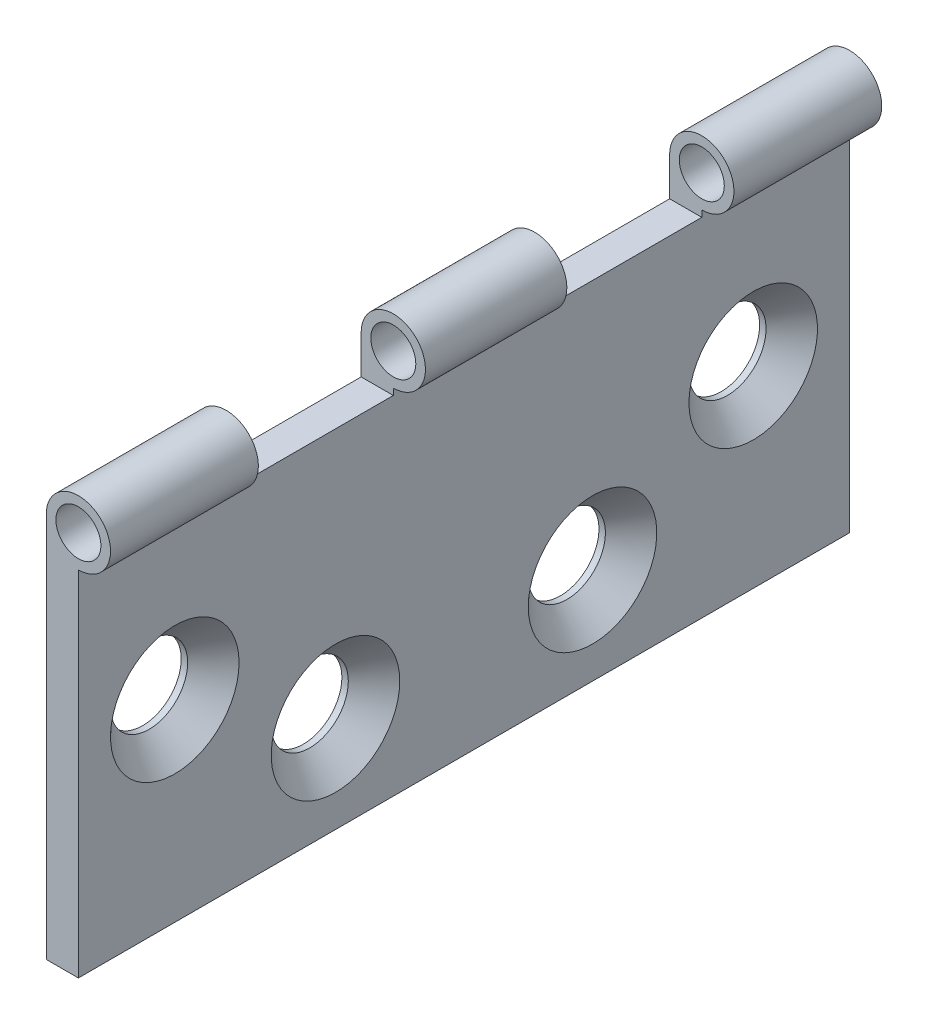
ISO-10303-21;
HEADER;
FILE_DESCRIPTION(('STEP AP214'),'2;1');
FILE_NAME('part.step','',(''),(''),'','','');
FILE_SCHEMA(('AUTOMOTIVE_DESIGN { 1 0 10303 214 1 1 1 1 }'));
ENDSEC;
DATA;
#1=APPLICATION_CONTEXT('core data for automotive mechanical design processes');
#2=APPLICATION_PROTOCOL_DEFINITION('international standard','automotive_design',2000,#1);
#3=PRODUCT_CONTEXT('',#1,'mechanical');
#4=PRODUCT('Part','Part','',(#3));
#5=PRODUCT_RELATED_PRODUCT_CATEGORY('part','',(#4));
#6=PRODUCT_DEFINITION_FORMATION('','',#4);
#7=PRODUCT_DEFINITION_CONTEXT('part definition',#1,'design');
#8=PRODUCT_DEFINITION('design','',#6,#7);
#9=PRODUCT_DEFINITION_SHAPE('','',#8);
#10=(LENGTH_UNIT() NAMED_UNIT(*) SI_UNIT(.MILLI.,.METRE.));
#11=(NAMED_UNIT(*) PLANE_ANGLE_UNIT() SI_UNIT($,.RADIAN.));
#12=(NAMED_UNIT(*) SI_UNIT($,.STERADIAN.) SOLID_ANGLE_UNIT());
#13=UNCERTAINTY_MEASURE_WITH_UNIT(LENGTH_MEASURE(1.E-05),#10,'distance_accuracy_value','');
#14=(GEOMETRIC_REPRESENTATION_CONTEXT(3) GLOBAL_UNCERTAINTY_ASSIGNED_CONTEXT((#13)) GLOBAL_UNIT_ASSIGNED_CONTEXT((#10,
#11,#12)) REPRESENTATION_CONTEXT('',''));
#15=CARTESIAN_POINT('',(0.,0.,0.));
#16=DIRECTION('',(0.,0.,1.));
#17=DIRECTION('',(1.,0.,0.));
#18=AXIS2_PLACEMENT_3D('',#15,#16,#17);
#19=CARTESIAN_POINT('',(5.,0.,60.));
#20=DIRECTION('',(-1.,0.,0.));
#21=DIRECTION('',(0.,0.,1.));
#22=AXIS2_PLACEMENT_3D('',#19,#20,#21);
#23=PLANE('',#22);
#24=CARTESIAN_POINT('',(5.,15.,-20.));
#25=DIRECTION('',(-1.,0.,0.));
#26=DIRECTION('',(0.,0.,1.));
#27=AXIS2_PLACEMENT_3D('',#24,#25,#26);
#28=CIRCLE('',#27,10.);
#29=CARTESIAN_POINT('',(5.,15.,-9.99999999999999));
#30=VERTEX_POINT('',#29);
#31=EDGE_CURVE('E197',#30,#30,#28,.T.);
#32=ORIENTED_EDGE('',*,*,#31,.T.);
#33=EDGE_LOOP('',(#32));
#34=FACE_BOUND('',#33,.T.);
#35=CARTESIAN_POINT('',(5.,30.,-45.));
#36=DIRECTION('',(-1.,0.,0.));
#37=DIRECTION('',(0.,0.,1.));
#38=AXIS2_PLACEMENT_3D('',#35,#36,#37);
#39=CIRCLE('',#38,10.);
#40=CARTESIAN_POINT('',(5.,30.,-35.));
#41=VERTEX_POINT('',#40);
#42=EDGE_CURVE('E206',#41,#41,#39,.T.);
#43=ORIENTED_EDGE('',*,*,#42,.T.);
#44=EDGE_LOOP('',(#43));
#45=FACE_BOUND('',#44,.T.);
#46=CARTESIAN_POINT('',(5.,30.,45.));
#47=DIRECTION('',(1.,0.,0.));
#48=DIRECTION('',(0.,0.,-1.));
#49=AXIS2_PLACEMENT_3D('',#46,#47,#48);
#50=CIRCLE('',#49,10.);
#51=CARTESIAN_POINT('',(5.,30.,35.));
#52=VERTEX_POINT('',#51);
#53=EDGE_CURVE('E215',#52,#52,#50,.T.);
#54=ORIENTED_EDGE('',*,*,#53,.F.);
#55=EDGE_LOOP('',(#54));
#56=FACE_BOUND('',#55,.T.);
#57=CARTESIAN_POINT('',(5.,15.,20.));
#58=DIRECTION('',(1.,0.,0.));
#59=DIRECTION('',(0.,0.,-1.));
#60=AXIS2_PLACEMENT_3D('',#57,#58,#59);
#61=CIRCLE('',#60,10.);
#62=CARTESIAN_POINT('',(5.,15.,9.99999999999999));
#63=VERTEX_POINT('',#62);
#64=EDGE_CURVE('E224',#63,#63,#61,.T.);
#65=ORIENTED_EDGE('',*,*,#64,.F.);
#66=EDGE_LOOP('',(#65));
#67=FACE_BOUND('',#66,.T.);
#68=DIRECTION('',(0.,1.,0.));
#69=VECTOR('',#68,1.);
#70=CARTESIAN_POINT('',(5.,0.,-37.));
#71=LINE('',#70,#69);
#72=CARTESIAN_POINT('',(5.,54.,-37.));
#73=VERTEX_POINT('',#72);
#74=CARTESIAN_POINT('',(5.,55.,-37.));
#75=VERTEX_POINT('',#74);
#76=EDGE_CURVE('E156',#73,#75,#71,.T.);
#77=ORIENTED_EDGE('',*,*,#76,.F.);
#78=DIRECTION('',(0.,0.,-1.));
#79=VECTOR('',#78,1.);
#80=CARTESIAN_POINT('',(5.,54.,60.));
#81=LINE('',#80,#79);
#82=CARTESIAN_POINT('',(5.,54.,-11.));
#83=VERTEX_POINT('',#82);
#84=EDGE_CURVE('E155',#83,#73,#81,.T.);
#85=ORIENTED_EDGE('',*,*,#84,.F.);
#86=DIRECTION('',(0.,-1.,0.));
#87=VECTOR('',#86,1.);
#88=CARTESIAN_POINT('',(5.,0.,-11.));
#89=LINE('',#88,#87);
#90=CARTESIAN_POINT('',(5.,55.,-11.));
#91=VERTEX_POINT('',#90);
#92=EDGE_CURVE('E186',#91,#83,#89,.T.);
#93=ORIENTED_EDGE('',*,*,#92,.F.);
#94=DIRECTION('',(0.,0.,-1.));
#95=VECTOR('',#94,1.);
#96=CARTESIAN_POINT('',(5.,55.,60.));
#97=LINE('',#96,#95);
#98=CARTESIAN_POINT('',(5.,55.,11.));
#99=VERTEX_POINT('',#98);
#100=EDGE_CURVE('E167',#99,#91,#97,.T.);
#101=ORIENTED_EDGE('',*,*,#100,.F.);
#102=DIRECTION('',(0.,1.,0.));
#103=VECTOR('',#102,1.);
#104=CARTESIAN_POINT('',(5.,0.,11.));
#105=LINE('',#104,#103);
#106=CARTESIAN_POINT('',(5.,54.,11.));
#107=VERTEX_POINT('',#106);
#108=EDGE_CURVE('E160',#107,#99,#105,.T.);
#109=ORIENTED_EDGE('',*,*,#108,.F.);
#110=DIRECTION('',(0.,0.,-1.));
#111=VECTOR('',#110,1.);
#112=CARTESIAN_POINT('',(5.,54.,60.));
#113=LINE('',#112,#111);
#114=CARTESIAN_POINT('',(5.,54.,37.));
#115=VERTEX_POINT('',#114);
#116=EDGE_CURVE('E145',#115,#107,#113,.T.);
#117=ORIENTED_EDGE('',*,*,#116,.F.);
#118=DIRECTION('',(0.,-1.,0.));
#119=VECTOR('',#118,1.);
#120=CARTESIAN_POINT('',(5.,0.,37.));
#121=LINE('',#120,#119);
#122=CARTESIAN_POINT('',(5.,55.,37.));
#123=VERTEX_POINT('',#122);
#124=EDGE_CURVE('E180',#123,#115,#121,.T.);
#125=ORIENTED_EDGE('',*,*,#124,.F.);
#126=CARTESIAN_POINT('',(5.,55.,60.));
#127=VERTEX_POINT('',#126);
#128=EDGE_CURVE('E248',#127,#123,#97,.T.);
#129=ORIENTED_EDGE('',*,*,#128,.F.);
#130=DIRECTION('',(0.,1.,0.));
#131=VECTOR('',#130,1.);
#132=CARTESIAN_POINT('',(5.,0.,60.));
#133=LINE('',#132,#131);
#134=CARTESIAN_POINT('',(5.,0.,60.));
#135=VERTEX_POINT('',#134);
#136=EDGE_CURVE('E252',#135,#127,#133,.T.);
#137=ORIENTED_EDGE('',*,*,#136,.F.);
#138=DIRECTION('',(0.,0.,-1.));
#139=VECTOR('',#138,1.);
#140=CARTESIAN_POINT('',(5.,0.,60.));
#141=LINE('',#140,#139);
#142=CARTESIAN_POINT('',(5.,0.,-60.));
#143=VERTEX_POINT('',#142);
#144=EDGE_CURVE('E261',#135,#143,#141,.T.);
#145=ORIENTED_EDGE('',*,*,#144,.T.);
#146=DIRECTION('',(0.,1.,0.));
#147=VECTOR('',#146,1.);
#148=CARTESIAN_POINT('',(5.,0.,-60.));
#149=LINE('',#148,#147);
#150=CARTESIAN_POINT('',(5.,55.,-60.));
#151=VERTEX_POINT('',#150);
#152=EDGE_CURVE('E251',#143,#151,#149,.T.);
#153=ORIENTED_EDGE('',*,*,#152,.T.);
#154=EDGE_CURVE('E247',#75,#151,#97,.T.);
#155=ORIENTED_EDGE('',*,*,#154,.F.);
#156=EDGE_LOOP('',(#77,#85,#93,#101,#109,#117,#125,#129,#137,#145,#153,#155));
#157=FACE_BOUND('',#156,.T.);
#158=ADVANCED_FACE('F48',(#34,#45,#56,#67,#157),#23,.F.);
#159=CARTESIAN_POINT('',(0.,0.,60.));
#160=DIRECTION('',(-1.,0.,0.));
#161=DIRECTION('',(0.,0.,1.));
#162=AXIS2_PLACEMENT_3D('',#159,#160,#161);
#163=PLANE('',#162);
#164=CARTESIAN_POINT('',(0.,15.,-20.));
#165=DIRECTION('',(-1.,0.,0.));
#166=DIRECTION('',(0.,0.,1.));
#167=AXIS2_PLACEMENT_3D('',#164,#165,#166);
#168=CIRCLE('',#167,6.);
#169=CARTESIAN_POINT('',(0.,15.,-14.));
#170=VERTEX_POINT('',#169);
#171=EDGE_CURVE('E200',#170,#170,#168,.T.);
#172=ORIENTED_EDGE('',*,*,#171,.F.);
#173=EDGE_LOOP('',(#172));
#174=FACE_BOUND('',#173,.T.);
#175=CARTESIAN_POINT('',(0.,30.,-45.));
#176=DIRECTION('',(-1.,0.,0.));
#177=DIRECTION('',(0.,0.,1.));
#178=AXIS2_PLACEMENT_3D('',#175,#176,#177);
#179=CIRCLE('',#178,6.);
#180=CARTESIAN_POINT('',(0.,30.,-39.));
#181=VERTEX_POINT('',#180);
#182=EDGE_CURVE('E209',#181,#181,#179,.T.);
#183=ORIENTED_EDGE('',*,*,#182,.F.);
#184=EDGE_LOOP('',(#183));
#185=FACE_BOUND('',#184,.T.);
#186=CARTESIAN_POINT('',(0.,30.,45.));
#187=DIRECTION('',(1.,0.,0.));
#188=DIRECTION('',(0.,0.,-1.));
#189=AXIS2_PLACEMENT_3D('',#186,#187,#188);
#190=CIRCLE('',#189,6.);
#191=CARTESIAN_POINT('',(0.,30.,39.));
#192=VERTEX_POINT('',#191);
#193=EDGE_CURVE('E221',#192,#192,#190,.T.);
#194=ORIENTED_EDGE('',*,*,#193,.T.);
#195=EDGE_LOOP('',(#194));
#196=FACE_BOUND('',#195,.T.);
#197=CARTESIAN_POINT('',(0.,15.,20.));
#198=DIRECTION('',(1.,0.,0.));
#199=DIRECTION('',(0.,0.,-1.));
#200=AXIS2_PLACEMENT_3D('',#197,#198,#199);
#201=CIRCLE('',#200,6.);
#202=CARTESIAN_POINT('',(0.,15.,14.));
#203=VERTEX_POINT('',#202);
#204=EDGE_CURVE('E230',#203,#203,#201,.T.);
#205=ORIENTED_EDGE('',*,*,#204,.T.);
#206=EDGE_LOOP('',(#205));
#207=FACE_BOUND('',#206,.T.);
#208=DIRECTION('',(0.,0.,-1.));
#209=VECTOR('',#208,1.);
#210=CARTESIAN_POINT('',(0.,54.,60.));
#211=LINE('',#210,#209);
#212=CARTESIAN_POINT('',(0.,54.,-11.));
#213=VERTEX_POINT('',#212);
#214=CARTESIAN_POINT('',(0.,54.,-37.));
#215=VERTEX_POINT('',#214);
#216=EDGE_CURVE('E13',#213,#215,#211,.T.);
#217=ORIENTED_EDGE('',*,*,#216,.T.);
#218=DIRECTION('',(0.,1.,0.));
#219=VECTOR('',#218,1.);
#220=CARTESIAN_POINT('',(0.,0.,-37.));
#221=LINE('',#220,#219);
#222=CARTESIAN_POINT('',(0.,60.,-37.));
#223=VERTEX_POINT('',#222);
#224=EDGE_CURVE('E191',#215,#223,#221,.T.);
#225=ORIENTED_EDGE('',*,*,#224,.T.);
#226=DIRECTION('',(0.,0.,-1.));
#227=VECTOR('',#226,1.);
#228=CARTESIAN_POINT('',(0.,60.,60.));
#229=LINE('',#228,#227);
#230=CARTESIAN_POINT('',(0.,60.,-60.));
#231=VERTEX_POINT('',#230);
#232=EDGE_CURVE('E272',#223,#231,#229,.T.);
#233=ORIENTED_EDGE('',*,*,#232,.T.);
#234=DIRECTION('',(0.,1.,0.));
#235=VECTOR('',#234,1.);
#236=CARTESIAN_POINT('',(0.,0.,-60.));
#237=LINE('',#236,#235);
#238=CARTESIAN_POINT('',(0.,0.,-60.));
#239=VERTEX_POINT('',#238);
#240=EDGE_CURVE('E264',#239,#231,#237,.T.);
#241=ORIENTED_EDGE('',*,*,#240,.F.);
#242=DIRECTION('',(0.,0.,-1.));
#243=VECTOR('',#242,1.);
#244=CARTESIAN_POINT('',(0.,0.,60.));
#245=LINE('',#244,#243);
#246=CARTESIAN_POINT('',(0.,0.,60.));
#247=VERTEX_POINT('',#246);
#248=EDGE_CURVE('E270',#247,#239,#245,.T.);
#249=ORIENTED_EDGE('',*,*,#248,.F.);
#250=DIRECTION('',(0.,1.,0.));
#251=VECTOR('',#250,1.);
#252=CARTESIAN_POINT('',(0.,0.,60.));
#253=LINE('',#252,#251);
#254=CARTESIAN_POINT('',(0.,60.,60.));
#255=VERTEX_POINT('',#254);
#256=EDGE_CURVE('E255',#247,#255,#253,.T.);
#257=ORIENTED_EDGE('',*,*,#256,.T.);
#258=CARTESIAN_POINT('',(0.,60.,37.));
#259=VERTEX_POINT('',#258);
#260=EDGE_CURVE('E273',#255,#259,#229,.T.);
#261=ORIENTED_EDGE('',*,*,#260,.T.);
#262=DIRECTION('',(0.,-1.,0.));
#263=VECTOR('',#262,1.);
#264=CARTESIAN_POINT('',(0.,0.,37.));
#265=LINE('',#264,#263);
#266=CARTESIAN_POINT('',(0.,54.,37.));
#267=VERTEX_POINT('',#266);
#268=EDGE_CURVE('E177',#259,#267,#265,.T.);
#269=ORIENTED_EDGE('',*,*,#268,.T.);
#270=DIRECTION('',(0.,0.,-1.));
#271=VECTOR('',#270,1.);
#272=CARTESIAN_POINT('',(0.,54.,60.));
#273=LINE('',#272,#271);
#274=CARTESIAN_POINT('',(0.,54.,11.));
#275=VERTEX_POINT('',#274);
#276=EDGE_CURVE('E55',#267,#275,#273,.T.);
#277=ORIENTED_EDGE('',*,*,#276,.T.);
#278=DIRECTION('',(0.,1.,0.));
#279=VECTOR('',#278,1.);
#280=CARTESIAN_POINT('',(0.,0.,11.));
#281=LINE('',#280,#279);
#282=CARTESIAN_POINT('',(0.,60.,11.));
#283=VERTEX_POINT('',#282);
#284=EDGE_CURVE('E163',#275,#283,#281,.T.);
#285=ORIENTED_EDGE('',*,*,#284,.T.);
#286=CARTESIAN_POINT('',(0.,60.,-11.));
#287=VERTEX_POINT('',#286);
#288=EDGE_CURVE('E276',#283,#287,#229,.T.);
#289=ORIENTED_EDGE('',*,*,#288,.T.);
#290=DIRECTION('',(0.,-1.,0.));
#291=VECTOR('',#290,1.);
#292=CARTESIAN_POINT('',(0.,0.,-11.));
#293=LINE('',#292,#291);
#294=EDGE_CURVE('E70',#287,#213,#293,.T.);
#295=ORIENTED_EDGE('',*,*,#294,.T.);
#296=EDGE_LOOP('',(#217,#225,#233,#241,#249,#257,#261,#269,#277,#285,#289,#295));
#297=FACE_BOUND('',#296,.T.);
#298=ADVANCED_FACE('F285',(#174,#185,#196,#207,#297),#163,.T.);
#299=CARTESIAN_POINT('',(5.,60.,60.));
#300=DIRECTION('',(0.,0.,-1.));
#301=DIRECTION('',(-1.,0.,0.));
#302=AXIS2_PLACEMENT_3D('',#299,#300,#301);
#303=CYLINDRICAL_SURFACE('',#302,5.);
#304=CARTESIAN_POINT('',(5.,60.,-37.));
#305=DIRECTION('',(0.,0.,1.));
#306=DIRECTION('',(1.,0.,0.));
#307=AXIS2_PLACEMENT_3D('',#304,#305,#306);
#308=CIRCLE('',#307,5.);
#309=EDGE_CURVE('E189',#75,#223,#308,.T.);
#310=ORIENTED_EDGE('',*,*,#309,.F.);
#311=ORIENTED_EDGE('',*,*,#154,.T.);
#312=CARTESIAN_POINT('',(5.,60.,-60.));
#313=DIRECTION('',(0.,0.,1.));
#314=DIRECTION('',(1.,0.,0.));
#315=AXIS2_PLACEMENT_3D('',#312,#313,#314);
#316=CIRCLE('',#315,5.);
#317=CARTESIAN_POINT('',(10.,60.,-60.));
#318=VERTEX_POINT('',#317);
#319=EDGE_CURVE('E243',#151,#318,#316,.T.);
#320=ORIENTED_EDGE('',*,*,#319,.T.);
#321=EDGE_CURVE('E244',#318,#231,#316,.T.);
#322=ORIENTED_EDGE('',*,*,#321,.T.);
#323=ORIENTED_EDGE('',*,*,#232,.F.);
#324=EDGE_LOOP('',(#310,#311,#320,#322,#323));
#325=FACE_BOUND('',#324,.T.);
#326=ADVANCED_FACE('F308',(#325),#303,.T.);
#327=ORIENTED_EDGE('',*,*,#100,.T.);
#328=CARTESIAN_POINT('',(5.,60.,-11.));
#329=DIRECTION('',(0.,0.,-1.));
#330=DIRECTION('',(-1.,0.,0.));
#331=AXIS2_PLACEMENT_3D('',#328,#329,#330);
#332=CIRCLE('',#331,5.);
#333=EDGE_CURVE('E183',#287,#91,#332,.T.);
#334=ORIENTED_EDGE('',*,*,#333,.F.);
#335=ORIENTED_EDGE('',*,*,#288,.F.);
#336=CARTESIAN_POINT('',(5.,60.,11.));
#337=DIRECTION('',(0.,0.,1.));
#338=DIRECTION('',(1.,0.,0.));
#339=AXIS2_PLACEMENT_3D('',#336,#337,#338);
#340=CIRCLE('',#339,5.);
#341=EDGE_CURVE('E62',#99,#283,#340,.T.);
#342=ORIENTED_EDGE('',*,*,#341,.F.);
#343=EDGE_LOOP('',(#327,#334,#335,#342));
#344=FACE_BOUND('',#343,.T.);
#345=ADVANCED_FACE('F324',(#344),#303,.T.);
#346=ORIENTED_EDGE('',*,*,#128,.T.);
#347=CARTESIAN_POINT('',(5.,60.,37.));
#348=DIRECTION('',(0.,0.,-1.));
#349=DIRECTION('',(-1.,0.,0.));
#350=AXIS2_PLACEMENT_3D('',#347,#348,#349);
#351=CIRCLE('',#350,5.);
#352=EDGE_CURVE('E171',#259,#123,#351,.T.);
#353=ORIENTED_EDGE('',*,*,#352,.F.);
#354=ORIENTED_EDGE('',*,*,#260,.F.);
#355=CARTESIAN_POINT('',(5.,60.,60.));
#356=DIRECTION('',(0.,0.,1.));
#357=DIRECTION('',(1.,0.,0.));
#358=AXIS2_PLACEMENT_3D('',#355,#356,#357);
#359=CIRCLE('',#358,5.);
#360=CARTESIAN_POINT('',(10.,60.,60.));
#361=VERTEX_POINT('',#360);
#362=EDGE_CURVE('E240',#361,#255,#359,.T.);
#363=ORIENTED_EDGE('',*,*,#362,.F.);
#364=EDGE_CURVE('E237',#127,#361,#359,.T.);
#365=ORIENTED_EDGE('',*,*,#364,.F.);
#366=EDGE_LOOP('',(#346,#353,#354,#363,#365));
#367=FACE_BOUND('',#366,.T.);
#368=ADVANCED_FACE('F321',(#367),#303,.T.);
#369=CARTESIAN_POINT('',(5.,60.,-60.));
#370=DIRECTION('',(0.,0.,1.));
#371=DIRECTION('',(1.,0.,0.));
#372=AXIS2_PLACEMENT_3D('',#369,#370,#371);
#373=CYLINDRICAL_SURFACE('',#372,3.5);
#374=CARTESIAN_POINT('',(5.,60.,-60.));
#375=DIRECTION('',(0.,0.,1.));
#376=DIRECTION('',(1.,0.,0.));
#377=AXIS2_PLACEMENT_3D('',#374,#375,#376);
#378=CIRCLE('',#377,3.5);
#379=CARTESIAN_POINT('',(8.5,60.,-60.));
#380=VERTEX_POINT('',#379);
#381=EDGE_CURVE('E234',#380,#380,#378,.T.);
#382=ORIENTED_EDGE('',*,*,#381,.F.);
#383=EDGE_LOOP('',(#382));
#384=FACE_BOUND('',#383,.T.);
#385=CARTESIAN_POINT('',(5.,60.,-37.));
#386=DIRECTION('',(0.,0.,1.));
#387=DIRECTION('',(1.,0.,0.));
#388=AXIS2_PLACEMENT_3D('',#385,#386,#387);
#389=CIRCLE('',#388,3.5);
#390=CARTESIAN_POINT('',(8.5,60.,-37.));
#391=VERTEX_POINT('',#390);
#392=EDGE_CURVE('E188',#391,#391,#389,.F.);
#393=ORIENTED_EDGE('',*,*,#392,.F.);
#394=EDGE_LOOP('',(#393));
#395=FACE_BOUND('',#394,.T.);
#396=ADVANCED_FACE('F323',(#384,#395),#373,.F.);
#397=CARTESIAN_POINT('',(5.,60.,60.));
#398=DIRECTION('',(0.,0.,1.));
#399=DIRECTION('',(1.,0.,0.));
#400=AXIS2_PLACEMENT_3D('',#397,#398,#399);
#401=CIRCLE('',#400,3.5);
#402=CARTESIAN_POINT('',(8.5,60.,60.));
#403=VERTEX_POINT('',#402);
#404=EDGE_CURVE('E233',#403,#403,#401,.T.);
#405=ORIENTED_EDGE('',*,*,#404,.T.);
#406=EDGE_LOOP('',(#405));
#407=FACE_BOUND('',#406,.T.);
#408=CARTESIAN_POINT('',(5.,60.,37.));
#409=DIRECTION('',(0.,0.,-1.));
#410=DIRECTION('',(-1.,0.,0.));
#411=AXIS2_PLACEMENT_3D('',#408,#409,#410);
#412=CIRCLE('',#411,3.5);
#413=CARTESIAN_POINT('',(1.5,60.,37.));
#414=VERTEX_POINT('',#413);
#415=EDGE_CURVE('E168',#414,#414,#412,.F.);
#416=ORIENTED_EDGE('',*,*,#415,.F.);
#417=EDGE_LOOP('',(#416));
#418=FACE_BOUND('',#417,.T.);
#419=ADVANCED_FACE('F330',(#407,#418),#373,.F.);
#420=CARTESIAN_POINT('',(5.,0.,60.));
#421=DIRECTION('',(0.,-1.,0.));
#422=DIRECTION('',(0.,0.,-1.));
#423=AXIS2_PLACEMENT_3D('',#420,#421,#422);
#424=PLANE('',#423);
#425=DIRECTION('',(-1.,0.,0.));
#426=VECTOR('',#425,1.);
#427=CARTESIAN_POINT('',(5.,0.,-60.));
#428=LINE('',#427,#426);
#429=EDGE_CURVE('E256',#143,#239,#428,.T.);
#430=ORIENTED_EDGE('',*,*,#429,.F.);
#431=ORIENTED_EDGE('',*,*,#144,.F.);
#432=DIRECTION('',(-1.,0.,0.));
#433=VECTOR('',#432,1.);
#434=CARTESIAN_POINT('',(5.,0.,60.));
#435=LINE('',#434,#433);
#436=EDGE_CURVE('E258',#135,#247,#435,.T.);
#437=ORIENTED_EDGE('',*,*,#436,.T.);
#438=ORIENTED_EDGE('',*,*,#248,.T.);
#439=EDGE_LOOP('',(#430,#431,#437,#438));
#440=FACE_BOUND('',#439,.T.);
#441=ADVANCED_FACE('F311',(#440),#424,.T.);
#442=CARTESIAN_POINT('',(0.,0.,60.));
#443=DIRECTION('',(0.,0.,-1.));
#444=DIRECTION('',(-1.,0.,0.));
#445=AXIS2_PLACEMENT_3D('',#442,#443,#444);
#446=PLANE('',#445);
#447=ORIENTED_EDGE('',*,*,#404,.F.);
#448=EDGE_LOOP('',(#447));
#449=FACE_BOUND('',#448,.T.);
#450=ORIENTED_EDGE('',*,*,#136,.T.);
#451=ORIENTED_EDGE('',*,*,#364,.T.);
#452=ORIENTED_EDGE('',*,*,#362,.T.);
#453=ORIENTED_EDGE('',*,*,#256,.F.);
#454=ORIENTED_EDGE('',*,*,#436,.F.);
#455=EDGE_LOOP('',(#450,#451,#452,#453,#454));
#456=FACE_BOUND('',#455,.T.);
#457=ADVANCED_FACE('F317',(#449,#456),#446,.F.);
#458=CARTESIAN_POINT('',(0.,0.,-60.));
#459=DIRECTION('',(0.,0.,-1.));
#460=DIRECTION('',(-1.,0.,0.));
#461=AXIS2_PLACEMENT_3D('',#458,#459,#460);
#462=PLANE('',#461);
#463=ORIENTED_EDGE('',*,*,#381,.T.);
#464=EDGE_LOOP('',(#463));
#465=FACE_BOUND('',#464,.T.);
#466=ORIENTED_EDGE('',*,*,#240,.T.);
#467=ORIENTED_EDGE('',*,*,#321,.F.);
#468=ORIENTED_EDGE('',*,*,#319,.F.);
#469=ORIENTED_EDGE('',*,*,#152,.F.);
#470=ORIENTED_EDGE('',*,*,#429,.T.);
#471=EDGE_LOOP('',(#466,#467,#468,#469,#470));
#472=FACE_BOUND('',#471,.T.);
#473=ADVANCED_FACE('F304',(#465,#472),#462,.T.);
#474=CARTESIAN_POINT('',(5.,15.,20.));
#475=DIRECTION('',(1.,0.,0.));
#476=DIRECTION('',(0.,0.,-1.));
#477=AXIS2_PLACEMENT_3D('',#474,#475,#476);
#478=CYLINDRICAL_SURFACE('',#477,6.);
#479=ORIENTED_EDGE('',*,*,#204,.F.);
#480=EDGE_LOOP('',(#479));
#481=FACE_BOUND('',#480,.T.);
#482=CARTESIAN_POINT('',(1.,15.,20.));
#483=DIRECTION('',(1.,0.,0.));
#484=DIRECTION('',(0.,0.,-1.));
#485=AXIS2_PLACEMENT_3D('',#482,#483,#484);
#486=CIRCLE('',#485,6.);
#487=CARTESIAN_POINT('',(1.,15.,14.));
#488=VERTEX_POINT('',#487);
#489=EDGE_CURVE('E227',#488,#488,#486,.T.);
#490=ORIENTED_EDGE('',*,*,#489,.T.);
#491=EDGE_LOOP('',(#490));
#492=FACE_BOUND('',#491,.T.);
#493=ADVANCED_FACE('F353',(#481,#492),#478,.F.);
#494=CARTESIAN_POINT('',(5.,15.,20.));
#495=DIRECTION('',(1.,0.,0.));
#496=DIRECTION('',(0.,0.,-1.));
#497=AXIS2_PLACEMENT_3D('',#494,#495,#496);
#498=CONICAL_SURFACE('',#497,10.,0.785398163397449);
#499=ORIENTED_EDGE('',*,*,#489,.F.);
#500=EDGE_LOOP('',(#499));
#501=FACE_BOUND('',#500,.T.);
#502=ORIENTED_EDGE('',*,*,#64,.T.);
#503=EDGE_LOOP('',(#502));
#504=FACE_BOUND('',#503,.T.);
#505=ADVANCED_FACE('F350',(#501,#504),#498,.F.);
#506=CARTESIAN_POINT('',(5.,30.,45.));
#507=DIRECTION('',(1.,0.,0.));
#508=DIRECTION('',(0.,0.,-1.));
#509=AXIS2_PLACEMENT_3D('',#506,#507,#508);
#510=CYLINDRICAL_SURFACE('',#509,6.);
#511=ORIENTED_EDGE('',*,*,#193,.F.);
#512=EDGE_LOOP('',(#511));
#513=FACE_BOUND('',#512,.T.);
#514=CARTESIAN_POINT('',(1.,30.,45.));
#515=DIRECTION('',(1.,0.,0.));
#516=DIRECTION('',(0.,0.,-1.));
#517=AXIS2_PLACEMENT_3D('',#514,#515,#516);
#518=CIRCLE('',#517,6.);
#519=CARTESIAN_POINT('',(1.,30.,39.));
#520=VERTEX_POINT('',#519);
#521=EDGE_CURVE('E218',#520,#520,#518,.T.);
#522=ORIENTED_EDGE('',*,*,#521,.T.);
#523=EDGE_LOOP('',(#522));
#524=FACE_BOUND('',#523,.T.);
#525=ADVANCED_FACE('F352',(#513,#524),#510,.F.);
#526=CARTESIAN_POINT('',(5.,30.,45.));
#527=DIRECTION('',(1.,0.,0.));
#528=DIRECTION('',(0.,0.,-1.));
#529=AXIS2_PLACEMENT_3D('',#526,#527,#528);
#530=CONICAL_SURFACE('',#529,10.,0.785398163397449);
#531=ORIENTED_EDGE('',*,*,#521,.F.);
#532=EDGE_LOOP('',(#531));
#533=FACE_BOUND('',#532,.T.);
#534=ORIENTED_EDGE('',*,*,#53,.T.);
#535=EDGE_LOOP('',(#534));
#536=FACE_BOUND('',#535,.T.);
#537=ADVANCED_FACE('F360',(#533,#536),#530,.F.);
#538=CARTESIAN_POINT('',(5.,30.,-45.));
#539=DIRECTION('',(1.,0.,0.));
#540=DIRECTION('',(0.,0.,1.));
#541=AXIS2_PLACEMENT_3D('',#538,#539,#540);
#542=CYLINDRICAL_SURFACE('',#541,6.);
#543=ORIENTED_EDGE('',*,*,#182,.T.);
#544=EDGE_LOOP('',(#543));
#545=FACE_BOUND('',#544,.T.);
#546=CARTESIAN_POINT('',(1.,30.,-45.));
#547=DIRECTION('',(-1.,0.,0.));
#548=DIRECTION('',(0.,0.,1.));
#549=AXIS2_PLACEMENT_3D('',#546,#547,#548);
#550=CIRCLE('',#549,6.);
#551=CARTESIAN_POINT('',(1.,30.,-39.));
#552=VERTEX_POINT('',#551);
#553=EDGE_CURVE('E212',#552,#552,#550,.T.);
#554=ORIENTED_EDGE('',*,*,#553,.F.);
#555=EDGE_LOOP('',(#554));
#556=FACE_BOUND('',#555,.T.);
#557=ADVANCED_FACE('F369',(#545,#556),#542,.F.);
#558=CARTESIAN_POINT('',(5.,30.,-45.));
#559=DIRECTION('',(1.,0.,0.));
#560=DIRECTION('',(0.,0.,1.));
#561=AXIS2_PLACEMENT_3D('',#558,#559,#560);
#562=CONICAL_SURFACE('',#561,10.,0.785398163397449);
#563=ORIENTED_EDGE('',*,*,#553,.T.);
#564=EDGE_LOOP('',(#563));
#565=FACE_BOUND('',#564,.T.);
#566=ORIENTED_EDGE('',*,*,#42,.F.);
#567=EDGE_LOOP('',(#566));
#568=FACE_BOUND('',#567,.T.);
#569=ADVANCED_FACE('F373',(#565,#568),#562,.F.);
#570=CARTESIAN_POINT('',(5.,15.,-20.));
#571=DIRECTION('',(1.,0.,0.));
#572=DIRECTION('',(0.,0.,1.));
#573=AXIS2_PLACEMENT_3D('',#570,#571,#572);
#574=CYLINDRICAL_SURFACE('',#573,6.);
#575=ORIENTED_EDGE('',*,*,#171,.T.);
#576=EDGE_LOOP('',(#575));
#577=FACE_BOUND('',#576,.T.);
#578=CARTESIAN_POINT('',(1.,15.,-20.));
#579=DIRECTION('',(-1.,0.,0.));
#580=DIRECTION('',(0.,0.,1.));
#581=AXIS2_PLACEMENT_3D('',#578,#579,#580);
#582=CIRCLE('',#581,6.);
#583=CARTESIAN_POINT('',(1.,15.,-14.));
#584=VERTEX_POINT('',#583);
#585=EDGE_CURVE('E203',#584,#584,#582,.T.);
#586=ORIENTED_EDGE('',*,*,#585,.F.);
#587=EDGE_LOOP('',(#586));
#588=FACE_BOUND('',#587,.T.);
#589=ADVANCED_FACE('F377',(#577,#588),#574,.F.);
#590=CARTESIAN_POINT('',(5.,15.,-20.));
#591=DIRECTION('',(1.,0.,0.));
#592=DIRECTION('',(0.,0.,1.));
#593=AXIS2_PLACEMENT_3D('',#590,#591,#592);
#594=CONICAL_SURFACE('',#593,10.,0.785398163397449);
#595=ORIENTED_EDGE('',*,*,#585,.T.);
#596=EDGE_LOOP('',(#595));
#597=FACE_BOUND('',#596,.T.);
#598=ORIENTED_EDGE('',*,*,#31,.F.);
#599=EDGE_LOOP('',(#598));
#600=FACE_BOUND('',#599,.T.);
#601=ADVANCED_FACE('F381',(#597,#600),#594,.F.);
#602=CARTESIAN_POINT('',(15.,54.,37.));
#603=DIRECTION('',(0.,1.,0.));
#604=DIRECTION('',(0.,0.,1.));
#605=AXIS2_PLACEMENT_3D('',#602,#603,#604);
#606=PLANE('',#605);
#607=ORIENTED_EDGE('',*,*,#116,.T.);
#608=DIRECTION('',(-1.,0.,0.));
#609=VECTOR('',#608,1.);
#610=CARTESIAN_POINT('',(15.,54.,11.));
#611=LINE('',#610,#609);
#612=EDGE_CURVE('E148',#107,#275,#611,.T.);
#613=ORIENTED_EDGE('',*,*,#612,.T.);
#614=ORIENTED_EDGE('',*,*,#276,.F.);
#615=DIRECTION('',(-1.,0.,0.));
#616=VECTOR('',#615,1.);
#617=CARTESIAN_POINT('',(15.,54.,37.));
#618=LINE('',#617,#616);
#619=EDGE_CURVE('E151',#115,#267,#618,.T.);
#620=ORIENTED_EDGE('',*,*,#619,.F.);
#621=EDGE_LOOP('',(#607,#613,#614,#620));
#622=FACE_BOUND('',#621,.T.);
#623=ADVANCED_FACE('F147',(#622),#606,.T.);
#624=CARTESIAN_POINT('',(15.,54.,37.));
#625=DIRECTION('',(0.,0.,-1.));
#626=DIRECTION('',(-1.,0.,0.));
#627=AXIS2_PLACEMENT_3D('',#624,#625,#626);
#628=PLANE('',#627);
#629=ORIENTED_EDGE('',*,*,#415,.T.);
#630=EDGE_LOOP('',(#629));
#631=FACE_BOUND('',#630,.T.);
#632=ORIENTED_EDGE('',*,*,#124,.T.);
#633=ORIENTED_EDGE('',*,*,#619,.T.);
#634=ORIENTED_EDGE('',*,*,#268,.F.);
#635=ORIENTED_EDGE('',*,*,#352,.T.);
#636=EDGE_LOOP('',(#632,#633,#634,#635));
#637=FACE_BOUND('',#636,.T.);
#638=ADVANCED_FACE('F288',(#631,#637),#628,.T.);
#639=CARTESIAN_POINT('',(15.,54.,11.));
#640=DIRECTION('',(0.,0.,1.));
#641=DIRECTION('',(1.,0.,0.));
#642=AXIS2_PLACEMENT_3D('',#639,#640,#641);
#643=PLANE('',#642);
#644=CARTESIAN_POINT('',(5.,60.,11.));
#645=DIRECTION('',(0.,0.,1.));
#646=DIRECTION('',(1.,0.,0.));
#647=AXIS2_PLACEMENT_3D('',#644,#645,#646);
#648=CIRCLE('',#647,3.5);
#649=CARTESIAN_POINT('',(8.5,60.,11.));
#650=VERTEX_POINT('',#649);
#651=EDGE_CURVE('E277',#650,#650,#648,.F.);
#652=ORIENTED_EDGE('',*,*,#651,.T.);
#653=EDGE_LOOP('',(#652));
#654=FACE_BOUND('',#653,.T.);
#655=ORIENTED_EDGE('',*,*,#108,.T.);
#656=ORIENTED_EDGE('',*,*,#341,.T.);
#657=ORIENTED_EDGE('',*,*,#284,.F.);
#658=ORIENTED_EDGE('',*,*,#612,.F.);
#659=EDGE_LOOP('',(#655,#656,#657,#658));
#660=FACE_BOUND('',#659,.T.);
#661=ADVANCED_FACE('F159',(#654,#660),#643,.T.);
#662=CARTESIAN_POINT('',(15.,54.,-11.));
#663=DIRECTION('',(0.,1.,0.));
#664=DIRECTION('',(0.,0.,1.));
#665=AXIS2_PLACEMENT_3D('',#662,#663,#664);
#666=PLANE('',#665);
#667=ORIENTED_EDGE('',*,*,#84,.T.);
#668=DIRECTION('',(-1.,0.,0.));
#669=VECTOR('',#668,1.);
#670=CARTESIAN_POINT('',(15.,54.,-37.));
#671=LINE('',#670,#669);
#672=EDGE_CURVE('E290',#73,#215,#671,.T.);
#673=ORIENTED_EDGE('',*,*,#672,.T.);
#674=ORIENTED_EDGE('',*,*,#216,.F.);
#675=DIRECTION('',(-1.,0.,0.));
#676=VECTOR('',#675,1.);
#677=CARTESIAN_POINT('',(15.,54.,-11.));
#678=LINE('',#677,#676);
#679=EDGE_CURVE('E279',#83,#213,#678,.T.);
#680=ORIENTED_EDGE('',*,*,#679,.F.);
#681=EDGE_LOOP('',(#667,#673,#674,#680));
#682=FACE_BOUND('',#681,.T.);
#683=ADVANCED_FACE('F393',(#682),#666,.T.);
#684=CARTESIAN_POINT('',(15.,54.,-37.));
#685=DIRECTION('',(0.,0.,1.));
#686=DIRECTION('',(1.,0.,0.));
#687=AXIS2_PLACEMENT_3D('',#684,#685,#686);
#688=PLANE('',#687);
#689=ORIENTED_EDGE('',*,*,#392,.T.);
#690=EDGE_LOOP('',(#689));
#691=FACE_BOUND('',#690,.T.);
#692=ORIENTED_EDGE('',*,*,#76,.T.);
#693=ORIENTED_EDGE('',*,*,#309,.T.);
#694=ORIENTED_EDGE('',*,*,#224,.F.);
#695=ORIENTED_EDGE('',*,*,#672,.F.);
#696=EDGE_LOOP('',(#692,#693,#694,#695));
#697=FACE_BOUND('',#696,.T.);
#698=ADVANCED_FACE('F395',(#691,#697),#688,.T.);
#699=CARTESIAN_POINT('',(15.,54.,-11.));
#700=DIRECTION('',(0.,0.,-1.));
#701=DIRECTION('',(-1.,0.,0.));
#702=AXIS2_PLACEMENT_3D('',#699,#700,#701);
#703=PLANE('',#702);
#704=CARTESIAN_POINT('',(5.,60.,-11.));
#705=DIRECTION('',(0.,0.,-1.));
#706=DIRECTION('',(-1.,0.,0.));
#707=AXIS2_PLACEMENT_3D('',#704,#705,#706);
#708=CIRCLE('',#707,3.5);
#709=CARTESIAN_POINT('',(1.5,60.,-11.));
#710=VERTEX_POINT('',#709);
#711=EDGE_CURVE('E182',#710,#710,#708,.F.);
#712=ORIENTED_EDGE('',*,*,#711,.T.);
#713=EDGE_LOOP('',(#712));
#714=FACE_BOUND('',#713,.T.);
#715=ORIENTED_EDGE('',*,*,#92,.T.);
#716=ORIENTED_EDGE('',*,*,#679,.T.);
#717=ORIENTED_EDGE('',*,*,#294,.F.);
#718=ORIENTED_EDGE('',*,*,#333,.T.);
#719=EDGE_LOOP('',(#715,#716,#717,#718));
#720=FACE_BOUND('',#719,.T.);
#721=ADVANCED_FACE('F296',(#714,#720),#703,.T.);
#722=ORIENTED_EDGE('',*,*,#651,.F.);
#723=EDGE_LOOP('',(#722));
#724=FACE_BOUND('',#723,.T.);
#725=ORIENTED_EDGE('',*,*,#711,.F.);
#726=EDGE_LOOP('',(#725));
#727=FACE_BOUND('',#726,.T.);
#728=ADVANCED_FACE('F333',(#724,#727),#373,.F.);
#729=CLOSED_SHELL('',(#158,#298,#326,#345,#368,#396,#419,#441,#457,#473,#493,#505,#525,#537,
#557,#569,#589,#601,#623,#638,#661,#683,#698,#721,#728));
#730=MANIFOLD_SOLID_BREP('B2',#729);
#731=ADVANCED_BREP_SHAPE_REPRESENTATION('',(#18,#730),#14);
#732=SHAPE_DEFINITION_REPRESENTATION(#9,#731);
ENDSEC;
END-ISO-10303-21;
